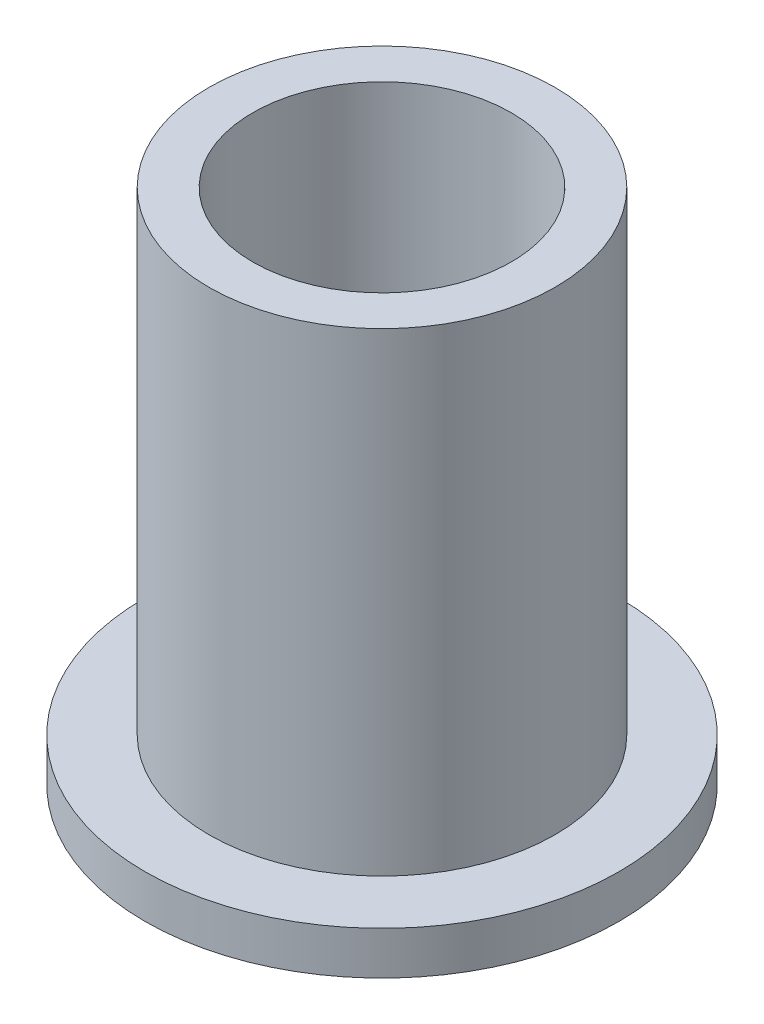
ISO-10303-21;
HEADER;
FILE_DESCRIPTION(('STEP AP214'),'2;1');
FILE_NAME('part.step','',(''),(''),'','','');
FILE_SCHEMA(('AUTOMOTIVE_DESIGN { 1 0 10303 214 1 1 1 1 }'));
ENDSEC;
DATA;
#1=APPLICATION_CONTEXT('core data for automotive mechanical design processes');
#2=APPLICATION_PROTOCOL_DEFINITION('international standard','automotive_design',2000,#1);
#3=PRODUCT_CONTEXT('',#1,'mechanical');
#4=PRODUCT('Part','Part','',(#3));
#5=PRODUCT_RELATED_PRODUCT_CATEGORY('part','',(#4));
#6=PRODUCT_DEFINITION_FORMATION('','',#4);
#7=PRODUCT_DEFINITION_CONTEXT('part definition',#1,'design');
#8=PRODUCT_DEFINITION('design','',#6,#7);
#9=PRODUCT_DEFINITION_SHAPE('','',#8);
#10=(LENGTH_UNIT() NAMED_UNIT(*) SI_UNIT(.MILLI.,.METRE.));
#11=(NAMED_UNIT(*) PLANE_ANGLE_UNIT() SI_UNIT($,.RADIAN.));
#12=(NAMED_UNIT(*) SI_UNIT($,.STERADIAN.) SOLID_ANGLE_UNIT());
#13=UNCERTAINTY_MEASURE_WITH_UNIT(LENGTH_MEASURE(1.E-05),#10,'distance_accuracy_value','');
#14=(GEOMETRIC_REPRESENTATION_CONTEXT(3) GLOBAL_UNCERTAINTY_ASSIGNED_CONTEXT((#13)) GLOBAL_UNIT_ASSIGNED_CONTEXT((#10,
#11,#12)) REPRESENTATION_CONTEXT('',''));
#15=CARTESIAN_POINT('',(0.,0.,0.));
#16=DIRECTION('',(0.,0.,1.));
#17=DIRECTION('',(1.,0.,0.));
#18=AXIS2_PLACEMENT_3D('',#15,#16,#17);
#19=CARTESIAN_POINT('',(0.,19.05,0.));
#20=DIRECTION('',(0.,1.,0.));
#21=DIRECTION('',(0.,0.,1.));
#22=AXIS2_PLACEMENT_3D('',#19,#20,#21);
#23=PLANE('',#22);
#24=CARTESIAN_POINT('',(0.,19.05,0.));
#25=DIRECTION('',(0.,1.,0.));
#26=DIRECTION('',(0.,0.,1.));
#27=AXIS2_PLACEMENT_3D('',#24,#25,#26);
#28=CIRCLE('',#27,6.3754);
#29=CARTESIAN_POINT('',(0.,19.05,-6.3754));
#30=VERTEX_POINT('',#29);
#31=EDGE_CURVE('E10',#30,#30,#28,.T.);
#32=ORIENTED_EDGE('',*,*,#31,.T.);
#33=EDGE_LOOP('',(#32));
#34=FACE_BOUND('',#33,.T.);
#35=CARTESIAN_POINT('',(0.,19.05,0.));
#36=DIRECTION('',(0.,1.,0.));
#37=DIRECTION('',(0.,0.,1.));
#38=AXIS2_PLACEMENT_3D('',#35,#36,#37);
#39=CIRCLE('',#38,4.7625);
#40=CARTESIAN_POINT('',(0.,19.05,-4.7625));
#41=VERTEX_POINT('',#40);
#42=EDGE_CURVE('E50',#41,#41,#39,.T.);
#43=ORIENTED_EDGE('',*,*,#42,.F.);
#44=EDGE_LOOP('',(#43));
#45=FACE_BOUND('',#44,.T.);
#46=ADVANCED_FACE('F39',(#34,#45),#23,.T.);
#47=CARTESIAN_POINT('',(0.,0.,0.));
#48=DIRECTION('',(0.,1.,0.));
#49=DIRECTION('',(0.,0.,1.));
#50=AXIS2_PLACEMENT_3D('',#47,#48,#49);
#51=PLANE('',#50);
#52=CARTESIAN_POINT('',(0.,0.,0.));
#53=DIRECTION('',(0.,1.,0.));
#54=DIRECTION('',(0.,0.,1.));
#55=AXIS2_PLACEMENT_3D('',#52,#53,#54);
#56=CIRCLE('',#55,4.7625);
#57=CARTESIAN_POINT('',(0.,0.,-4.7625));
#58=VERTEX_POINT('',#57);
#59=EDGE_CURVE('E52',#58,#58,#56,.T.);
#60=ORIENTED_EDGE('',*,*,#59,.T.);
#61=EDGE_LOOP('',(#60));
#62=FACE_BOUND('',#61,.T.);
#63=CARTESIAN_POINT('',(0.,0.,0.));
#64=DIRECTION('',(0.,1.,0.));
#65=DIRECTION('',(0.,0.,1.));
#66=AXIS2_PLACEMENT_3D('',#63,#64,#65);
#67=CIRCLE('',#66,8.73125);
#68=CARTESIAN_POINT('',(0.,0.,8.73125));
#69=VERTEX_POINT('',#68);
#70=EDGE_CURVE('E65',#69,#69,#67,.T.);
#71=ORIENTED_EDGE('',*,*,#70,.F.);
#72=EDGE_LOOP('',(#71));
#73=FACE_BOUND('',#72,.T.);
#74=ADVANCED_FACE('F93',(#62,#73),#51,.F.);
#75=CARTESIAN_POINT('',(0.,19.05,0.));
#76=DIRECTION('',(0.,-1.,0.));
#77=DIRECTION('',(0.,0.,-1.));
#78=AXIS2_PLACEMENT_3D('',#75,#76,#77);
#79=CYLINDRICAL_SURFACE('',#78,6.3754);
#80=CARTESIAN_POINT('',(0.,1.5875,0.));
#81=DIRECTION('',(0.,1.,0.));
#82=DIRECTION('',(0.,0.,1.));
#83=AXIS2_PLACEMENT_3D('',#80,#81,#82);
#84=CIRCLE('',#83,6.3754);
#85=CARTESIAN_POINT('',(0.,1.5875,-6.3754));
#86=VERTEX_POINT('',#85);
#87=EDGE_CURVE('E66',#86,#86,#84,.T.);
#88=CARTESIAN_POINT('',(0.,1.5875,-6.3754));
#89=CARTESIAN_POINT('',(0.,1.76940104166667,-6.3754));
#90=CARTESIAN_POINT('',(0.,1.95130208333333,-6.3754));
#91=CARTESIAN_POINT('',(0.,2.31510416666667,-6.3754));
#92=CARTESIAN_POINT('',(0.,2.49700520833333,-6.3754));
#93=CARTESIAN_POINT('',(0.,2.86080729166667,-6.3754));
#94=CARTESIAN_POINT('',(0.,3.04270833333333,-6.3754));
#95=CARTESIAN_POINT('',(0.,3.40651041666667,-6.3754));
#96=CARTESIAN_POINT('',(0.,3.58841145833333,-6.3754));
#97=CARTESIAN_POINT('',(0.,3.95221354166666,-6.3754));
#98=CARTESIAN_POINT('',(0.,4.13411458333333,-6.3754));
#99=CARTESIAN_POINT('',(0.,4.49791666666666,-6.3754));
#100=CARTESIAN_POINT('',(0.,4.67981770833333,-6.3754));
#101=CARTESIAN_POINT('',(0.,5.04361979166666,-6.3754));
#102=CARTESIAN_POINT('',(0.,5.22552083333333,-6.3754));
#103=CARTESIAN_POINT('',(0.,5.58932291666666,-6.3754));
#104=CARTESIAN_POINT('',(0.,5.77122395833333,-6.3754));
#105=CARTESIAN_POINT('',(0.,6.13502604166666,-6.3754));
#106=CARTESIAN_POINT('',(0.,6.31692708333333,-6.3754));
#107=CARTESIAN_POINT('',(0.,6.68072916666666,-6.3754));
#108=CARTESIAN_POINT('',(0.,6.86263020833333,-6.3754));
#109=CARTESIAN_POINT('',(0.,7.22643229166666,-6.3754));
#110=CARTESIAN_POINT('',(0.,7.40833333333333,-6.3754));
#111=CARTESIAN_POINT('',(0.,7.77213541666666,-6.3754));
#112=CARTESIAN_POINT('',(0.,7.95403645833333,-6.3754));
#113=CARTESIAN_POINT('',(0.,8.31783854166666,-6.3754));
#114=CARTESIAN_POINT('',(0.,8.49973958333333,-6.3754));
#115=CARTESIAN_POINT('',(0.,8.86354166666666,-6.3754));
#116=CARTESIAN_POINT('',(0.,9.04544270833333,-6.3754));
#117=CARTESIAN_POINT('',(0.,9.40924479166666,-6.3754));
#118=CARTESIAN_POINT('',(0.,9.59114583333333,-6.3754));
#119=CARTESIAN_POINT('',(0.,9.95494791666667,-6.3754));
#120=CARTESIAN_POINT('',(0.,10.1368489583333,-6.3754));
#121=CARTESIAN_POINT('',(0.,10.5006510416667,-6.3754));
#122=CARTESIAN_POINT('',(0.,10.6825520833333,-6.3754));
#123=CARTESIAN_POINT('',(0.,11.0463541666667,-6.3754));
#124=CARTESIAN_POINT('',(0.,11.2282552083333,-6.3754));
#125=CARTESIAN_POINT('',(0.,11.5920572916667,-6.3754));
#126=CARTESIAN_POINT('',(0.,11.7739583333333,-6.3754));
#127=CARTESIAN_POINT('',(0.,12.1377604166667,-6.3754));
#128=CARTESIAN_POINT('',(0.,12.3196614583333,-6.3754));
#129=CARTESIAN_POINT('',(0.,12.6834635416667,-6.3754));
#130=CARTESIAN_POINT('',(0.,12.8653645833333,-6.3754));
#131=CARTESIAN_POINT('',(0.,13.2291666666667,-6.3754));
#132=CARTESIAN_POINT('',(0.,13.4110677083333,-6.3754));
#133=CARTESIAN_POINT('',(0.,13.7748697916667,-6.3754));
#134=CARTESIAN_POINT('',(0.,13.9567708333333,-6.3754));
#135=CARTESIAN_POINT('',(0.,14.3205729166667,-6.3754));
#136=CARTESIAN_POINT('',(0.,14.5024739583333,-6.3754));
#137=CARTESIAN_POINT('',(0.,14.8662760416667,-6.3754));
#138=CARTESIAN_POINT('',(0.,15.0481770833333,-6.3754));
#139=CARTESIAN_POINT('',(0.,15.4119791666667,-6.3754));
#140=CARTESIAN_POINT('',(0.,15.5938802083333,-6.3754));
#141=CARTESIAN_POINT('',(0.,15.9576822916667,-6.3754));
#142=CARTESIAN_POINT('',(0.,16.1395833333333,-6.3754));
#143=CARTESIAN_POINT('',(0.,16.5033854166667,-6.3754));
#144=CARTESIAN_POINT('',(0.,16.6852864583333,-6.3754));
#145=CARTESIAN_POINT('',(0.,17.0490885416667,-6.3754));
#146=CARTESIAN_POINT('',(0.,17.2309895833333,-6.3754));
#147=CARTESIAN_POINT('',(0.,17.5947916666667,-6.3754));
#148=CARTESIAN_POINT('',(0.,17.7766927083333,-6.3754));
#149=CARTESIAN_POINT('',(0.,18.1404947916667,-6.3754));
#150=CARTESIAN_POINT('',(0.,18.3223958333333,-6.3754));
#151=CARTESIAN_POINT('',(0.,18.6861979166667,-6.3754));
#152=CARTESIAN_POINT('',(0.,18.8680989583333,-6.3754));
#153=CARTESIAN_POINT('',(0.,19.05,-6.3754));
#154=B_SPLINE_CURVE_WITH_KNOTS('',3,(#88,#89,#90,#91,#92,#93,#94,#95,#96,#97,#98,#99,#100,#101,
#102,#103,#104,#105,#106,#107,#108,#109,#110,#111,#112,#113,#114,#115,#116,#117,#118,#119,#120,
#121,#122,#123,#124,#125,#126,#127,#128,#129,#130,#131,#132,#133,#134,#135,#136,#137,#138,#139,
#140,#141,#142,#143,#144,#145,#146,#147,#148,#149,#150,#151,#152,#153),.UNSPECIFIED.,.F.,.F.,(4,
2,2,2,2,2,2,2,2,2,2,2,2,2,2,2,2,2,2,2,2,2,2,2,2,2,2,2,2,2,2,2,4),(0.,0.545703125000002,
1.09140625,1.637109375,2.1828125,2.728515625,3.27421875,3.819921875,4.365625,4.911328125,
5.45703125,6.002734375,6.5484375,7.094140625,7.63984375,8.185546875,8.73125,9.276953125,
9.82265625,10.368359375,10.9140625,11.459765625,12.00546875,12.551171875,13.096875,13.642578125,
14.18828125,14.733984375,15.2796875,15.825390625,16.37109375,16.916796875,17.4625),.UNSPECIFIED.);
#155=EDGE_CURVE('BSEAM41',#86,#30,#154,.T.);
#156=ORIENTED_EDGE('',*,*,#87,.T.);
#157=ORIENTED_EDGE('',*,*,#31,.F.);
#158=ORIENTED_EDGE('',*,*,#155,.T.);
#159=ORIENTED_EDGE('',*,*,#155,.F.);
#160=EDGE_LOOP('',(#156,#158,#157,#159));
#161=FACE_BOUND('',#160,.T.);
#162=ADVANCED_FACE('F41',(#161),#79,.T.);
#163=CARTESIAN_POINT('',(0.,19.05,0.));
#164=DIRECTION('',(0.,-1.,0.));
#165=DIRECTION('',(0.,0.,-1.));
#166=AXIS2_PLACEMENT_3D('',#163,#164,#165);
#167=CYLINDRICAL_SURFACE('',#166,4.7625);
#168=CARTESIAN_POINT('',(0.,19.05,-4.7625));
#169=CARTESIAN_POINT('',(0.,18.8515625,-4.7625));
#170=CARTESIAN_POINT('',(0.,18.653125,-4.7625));
#171=CARTESIAN_POINT('',(0.,18.25625,-4.7625));
#172=CARTESIAN_POINT('',(0.,18.0578125,-4.7625));
#173=CARTESIAN_POINT('',(0.,17.6609375,-4.7625));
#174=CARTESIAN_POINT('',(0.,17.4625,-4.7625));
#175=CARTESIAN_POINT('',(0.,17.065625,-4.7625));
#176=CARTESIAN_POINT('',(0.,16.8671875,-4.7625));
#177=CARTESIAN_POINT('',(0.,16.4703125,-4.7625));
#178=CARTESIAN_POINT('',(0.,16.271875,-4.7625));
#179=CARTESIAN_POINT('',(0.,15.875,-4.7625));
#180=CARTESIAN_POINT('',(0.,15.6765625,-4.7625));
#181=CARTESIAN_POINT('',(0.,15.2796875,-4.7625));
#182=CARTESIAN_POINT('',(0.,15.08125,-4.7625));
#183=CARTESIAN_POINT('',(0.,14.684375,-4.7625));
#184=CARTESIAN_POINT('',(0.,14.4859375,-4.7625));
#185=CARTESIAN_POINT('',(0.,14.0890625,-4.7625));
#186=CARTESIAN_POINT('',(0.,13.890625,-4.7625));
#187=CARTESIAN_POINT('',(0.,13.49375,-4.7625));
#188=CARTESIAN_POINT('',(0.,13.2953125,-4.7625));
#189=CARTESIAN_POINT('',(0.,12.8984375,-4.7625));
#190=CARTESIAN_POINT('',(0.,12.7,-4.7625));
#191=CARTESIAN_POINT('',(0.,12.303125,-4.7625));
#192=CARTESIAN_POINT('',(0.,12.1046875,-4.7625));
#193=CARTESIAN_POINT('',(0.,11.7078125,-4.7625));
#194=CARTESIAN_POINT('',(0.,11.509375,-4.7625));
#195=CARTESIAN_POINT('',(0.,11.1125,-4.7625));
#196=CARTESIAN_POINT('',(0.,10.9140625,-4.7625));
#197=CARTESIAN_POINT('',(0.,10.5171875,-4.7625));
#198=CARTESIAN_POINT('',(0.,10.31875,-4.7625));
#199=CARTESIAN_POINT('',(0.,9.921875,-4.7625));
#200=CARTESIAN_POINT('',(0.,9.7234375,-4.7625));
#201=CARTESIAN_POINT('',(0.,9.3265625,-4.7625));
#202=CARTESIAN_POINT('',(0.,9.128125,-4.7625));
#203=CARTESIAN_POINT('',(0.,8.73125,-4.7625));
#204=CARTESIAN_POINT('',(0.,8.5328125,-4.7625));
#205=CARTESIAN_POINT('',(0.,8.1359375,-4.7625));
#206=CARTESIAN_POINT('',(0.,7.9375,-4.7625));
#207=CARTESIAN_POINT('',(0.,7.540625,-4.7625));
#208=CARTESIAN_POINT('',(0.,7.3421875,-4.7625));
#209=CARTESIAN_POINT('',(0.,6.9453125,-4.7625));
#210=CARTESIAN_POINT('',(0.,6.746875,-4.7625));
#211=CARTESIAN_POINT('',(0.,6.35,-4.7625));
#212=CARTESIAN_POINT('',(0.,6.1515625,-4.7625));
#213=CARTESIAN_POINT('',(0.,5.7546875,-4.7625));
#214=CARTESIAN_POINT('',(0.,5.55625,-4.7625));
#215=CARTESIAN_POINT('',(0.,5.159375,-4.7625));
#216=CARTESIAN_POINT('',(0.,4.9609375,-4.7625));
#217=CARTESIAN_POINT('',(0.,4.5640625,-4.7625));
#218=CARTESIAN_POINT('',(0.,4.365625,-4.7625));
#219=CARTESIAN_POINT('',(0.,3.96875,-4.7625));
#220=CARTESIAN_POINT('',(0.,3.7703125,-4.7625));
#221=CARTESIAN_POINT('',(0.,3.3734375,-4.7625));
#222=CARTESIAN_POINT('',(0.,3.175,-4.7625));
#223=CARTESIAN_POINT('',(0.,2.778125,-4.7625));
#224=CARTESIAN_POINT('',(0.,2.5796875,-4.7625));
#225=CARTESIAN_POINT('',(0.,2.1828125,-4.7625));
#226=CARTESIAN_POINT('',(0.,1.984375,-4.7625));
#227=CARTESIAN_POINT('',(0.,1.5875,-4.7625));
#228=CARTESIAN_POINT('',(0.,1.3890625,-4.7625));
#229=CARTESIAN_POINT('',(0.,0.992187500000001,-4.7625));
#230=CARTESIAN_POINT('',(0.,0.793750000000001,-4.7625));
#231=CARTESIAN_POINT('',(0.,0.396875,-4.7625));
#232=CARTESIAN_POINT('',(0.,0.1984375,-4.7625));
#233=CARTESIAN_POINT('',(0.,0.,-4.7625));
#234=B_SPLINE_CURVE_WITH_KNOTS('',3,(#168,#169,#170,#171,#172,#173,#174,#175,#176,#177,#178,
#179,#180,#181,#182,#183,#184,#185,#186,#187,#188,#189,#190,#191,#192,#193,#194,#195,#196,#197,
#198,#199,#200,#201,#202,#203,#204,#205,#206,#207,#208,#209,#210,#211,#212,#213,#214,#215,#216,
#217,#218,#219,#220,#221,#222,#223,#224,#225,#226,#227,#228,#229,#230,#231,#232,#233),
.UNSPECIFIED.,.F.,.F.,(4,2,2,2,2,2,2,2,2,2,2,2,2,2,2,2,2,2,2,2,2,2,2,2,2,2,2,2,2,2,2,2,4),(0.,
0.5953125,1.190625,1.7859375,2.38125,2.9765625,3.571875,4.1671875,4.7625,5.3578125,5.953125,
6.5484375,7.14375,7.7390625,8.334375,8.9296875,9.525,10.1203125,10.715625,11.3109375,11.90625,
12.5015625,13.096875,13.6921875,14.2875,14.8828125,15.478125,16.0734375,16.66875,17.2640625,
17.859375,18.4546875,19.05),.UNSPECIFIED.);
#235=EDGE_CURVE('BSEAM78',#41,#58,#234,.T.);
#236=ORIENTED_EDGE('',*,*,#42,.T.);
#237=ORIENTED_EDGE('',*,*,#59,.F.);
#238=ORIENTED_EDGE('',*,*,#235,.T.);
#239=ORIENTED_EDGE('',*,*,#235,.F.);
#240=EDGE_LOOP('',(#236,#238,#237,#239));
#241=FACE_BOUND('',#240,.T.);
#242=ADVANCED_FACE('F78',(#241),#167,.F.);
#243=CARTESIAN_POINT('',(0.,1.5875,0.));
#244=DIRECTION('',(0.,1.,0.));
#245=DIRECTION('',(0.,0.,1.));
#246=AXIS2_PLACEMENT_3D('',#243,#244,#245);
#247=PLANE('',#246);
#248=CARTESIAN_POINT('',(0.,1.5875,0.));
#249=DIRECTION('',(0.,1.,0.));
#250=DIRECTION('',(0.,0.,1.));
#251=AXIS2_PLACEMENT_3D('',#248,#249,#250);
#252=CIRCLE('',#251,8.73125);
#253=CARTESIAN_POINT('',(0.,1.5875,8.73125));
#254=VERTEX_POINT('',#253);
#255=EDGE_CURVE('E58',#254,#254,#252,.T.);
#256=ORIENTED_EDGE('',*,*,#255,.T.);
#257=EDGE_LOOP('',(#256));
#258=FACE_BOUND('',#257,.T.);
#259=ORIENTED_EDGE('',*,*,#87,.F.);
#260=EDGE_LOOP('',(#259));
#261=FACE_BOUND('',#260,.T.);
#262=ADVANCED_FACE('F80',(#258,#261),#247,.T.);
#263=CARTESIAN_POINT('',(0.,1.5875,0.));
#264=DIRECTION('',(0.,-1.,0.));
#265=DIRECTION('',(0.,0.,-1.));
#266=AXIS2_PLACEMENT_3D('',#263,#264,#265);
#267=CYLINDRICAL_SURFACE('',#266,8.73125);
#268=ORIENTED_EDGE('',*,*,#255,.F.);
#269=EDGE_LOOP('',(#268));
#270=FACE_BOUND('',#269,.T.);
#271=ORIENTED_EDGE('',*,*,#70,.T.);
#272=EDGE_LOOP('',(#271));
#273=FACE_BOUND('',#272,.T.);
#274=ADVANCED_FACE('F79',(#270,#273),#267,.T.);
#275=CLOSED_SHELL('',(#46,#74,#162,#242,#262,#274));
#276=MANIFOLD_SOLID_BREP('B2',#275);
#277=ADVANCED_BREP_SHAPE_REPRESENTATION('',(#18,#276),#14);
#278=SHAPE_DEFINITION_REPRESENTATION(#9,#277);
ENDSEC;
END-ISO-10303-21;
